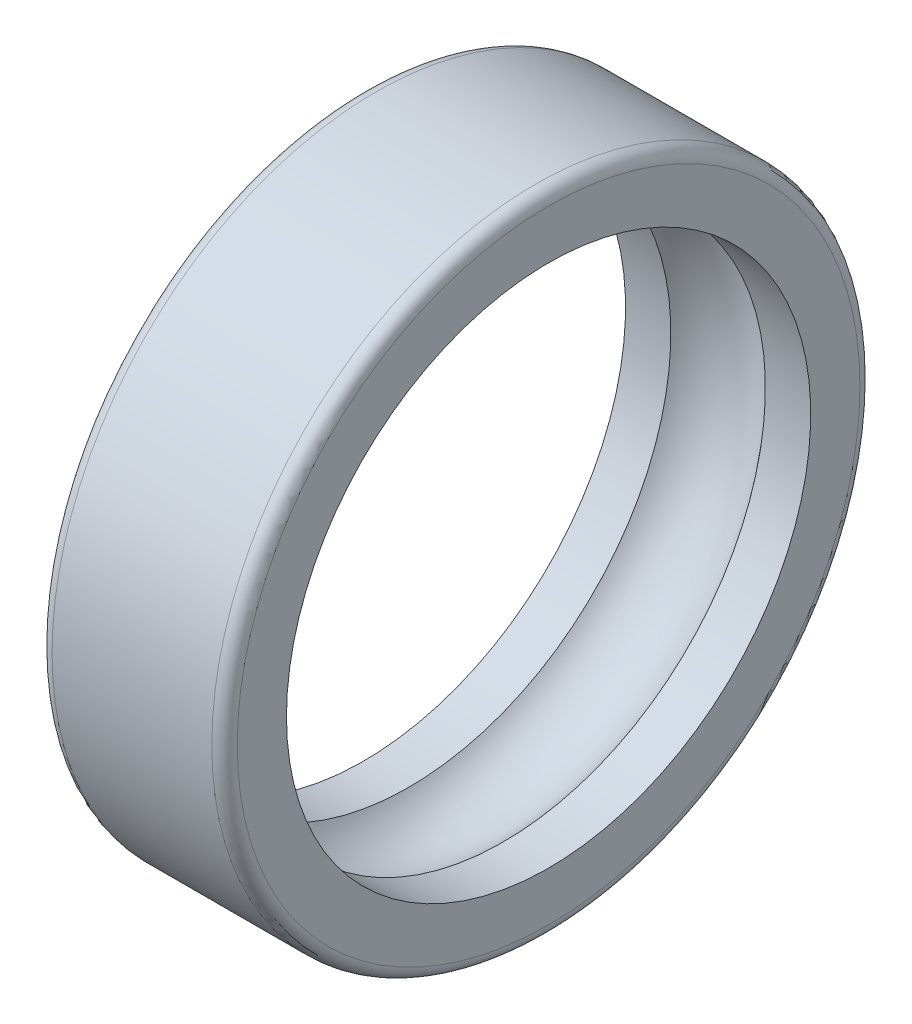
ISO-10303-21;
HEADER;
FILE_DESCRIPTION(('STEP AP214'),'2;1');
FILE_NAME('part.step','',(''),(''),'','','');
FILE_SCHEMA(('AUTOMOTIVE_DESIGN { 1 0 10303 214 1 1 1 1 }'));
ENDSEC;
DATA;
#1=APPLICATION_CONTEXT('core data for automotive mechanical design processes');
#2=APPLICATION_PROTOCOL_DEFINITION('international standard','automotive_design',2000,#1);
#3=PRODUCT_CONTEXT('',#1,'mechanical');
#4=PRODUCT('Part','Part','',(#3));
#5=PRODUCT_RELATED_PRODUCT_CATEGORY('part','',(#4));
#6=PRODUCT_DEFINITION_FORMATION('','',#4);
#7=PRODUCT_DEFINITION_CONTEXT('part definition',#1,'design');
#8=PRODUCT_DEFINITION('design','',#6,#7);
#9=PRODUCT_DEFINITION_SHAPE('','',#8);
#10=(LENGTH_UNIT() NAMED_UNIT(*) SI_UNIT(.MILLI.,.METRE.));
#11=(NAMED_UNIT(*) PLANE_ANGLE_UNIT() SI_UNIT($,.RADIAN.));
#12=(NAMED_UNIT(*) SI_UNIT($,.STERADIAN.) SOLID_ANGLE_UNIT());
#13=UNCERTAINTY_MEASURE_WITH_UNIT(LENGTH_MEASURE(1.E-05),#10,'distance_accuracy_value','');
#14=(GEOMETRIC_REPRESENTATION_CONTEXT(3) GLOBAL_UNCERTAINTY_ASSIGNED_CONTEXT((#13)) GLOBAL_UNIT_ASSIGNED_CONTEXT((#10,
#11,#12)) REPRESENTATION_CONTEXT('',''));
#15=CARTESIAN_POINT('',(0.,0.,0.));
#16=DIRECTION('',(0.,0.,1.));
#17=DIRECTION('',(1.,0.,0.));
#18=AXIS2_PLACEMENT_3D('',#15,#16,#17);
#19=CARTESIAN_POINT('',(1.10000000000035,0.,0.));
#20=DIRECTION('',(-1.,0.,0.));
#21=DIRECTION('',(0.,0.,1.));
#22=AXIS2_PLACEMENT_3D('',#19,#20,#21);
#23=TOROIDAL_SURFACE('',#22,26.8999999999997,1.10000000000035);
#24=CARTESIAN_POINT('',(0.,0.,0.));
#25=DIRECTION('',(-1.,0.,0.));
#26=DIRECTION('',(0.,0.,1.));
#27=AXIS2_PLACEMENT_3D('',#24,#25,#26);
#28=CIRCLE('',#27,26.9);
#29=CARTESIAN_POINT('',(0.,0.,26.9));
#30=VERTEX_POINT('',#29);
#31=EDGE_CURVE('E10',#30,#30,#28,.T.);
#32=ORIENTED_EDGE('',*,*,#31,.F.);
#33=EDGE_LOOP('',(#32));
#34=FACE_BOUND('',#33,.T.);
#35=CARTESIAN_POINT('',(1.09999999999999,0.,0.));
#36=DIRECTION('',(-1.,0.,0.));
#37=DIRECTION('',(0.,0.,1.));
#38=AXIS2_PLACEMENT_3D('',#35,#36,#37);
#39=CIRCLE('',#38,28.);
#40=CARTESIAN_POINT('',(1.09999999999999,0.,28.));
#41=VERTEX_POINT('',#40);
#42=EDGE_CURVE('E63',#41,#41,#39,.T.);
#43=ORIENTED_EDGE('',*,*,#42,.T.);
#44=EDGE_LOOP('',(#43));
#45=FACE_BOUND('',#44,.T.);
#46=ADVANCED_FACE('F35',(#34,#45),#23,.T.);
#47=CARTESIAN_POINT('',(0.,26.9,0.));
#48=DIRECTION('',(1.,0.,0.));
#49=DIRECTION('',(0.,0.,-1.));
#50=AXIS2_PLACEMENT_3D('',#47,#48,#49);
#51=PLANE('',#50);
#52=CARTESIAN_POINT('',(0.,0.,0.));
#53=DIRECTION('',(-1.,0.,0.));
#54=DIRECTION('',(0.,0.,1.));
#55=AXIS2_PLACEMENT_3D('',#52,#53,#54);
#56=CIRCLE('',#55,22.65);
#57=CARTESIAN_POINT('',(0.,0.,22.65));
#58=VERTEX_POINT('',#57);
#59=EDGE_CURVE('E41',#58,#58,#56,.T.);
#60=ORIENTED_EDGE('',*,*,#59,.F.);
#61=EDGE_LOOP('',(#60));
#62=FACE_BOUND('',#61,.T.);
#63=ORIENTED_EDGE('',*,*,#31,.T.);
#64=EDGE_LOOP('',(#63));
#65=FACE_BOUND('',#64,.T.);
#66=ADVANCED_FACE('F100',(#62,#65),#51,.F.);
#67=CARTESIAN_POINT('',(200.,0.,0.));
#68=DIRECTION('',(-1.,0.,0.));
#69=DIRECTION('',(0.,0.,1.));
#70=AXIS2_PLACEMENT_3D('',#67,#68,#69);
#71=CYLINDRICAL_SURFACE('',#70,22.65);
#72=CARTESIAN_POINT('',(3.91368867436659,0.,0.));
#73=DIRECTION('',(-1.,0.,0.));
#74=DIRECTION('',(0.,0.,1.));
#75=AXIS2_PLACEMENT_3D('',#72,#73,#74);
#76=CIRCLE('',#75,22.65);
#77=CARTESIAN_POINT('',(3.91368867436659,0.,22.65));
#78=VERTEX_POINT('',#77);
#79=EDGE_CURVE('E45',#78,#78,#76,.T.);
#80=ORIENTED_EDGE('',*,*,#79,.F.);
#81=EDGE_LOOP('',(#80));
#82=FACE_BOUND('',#81,.T.);
#83=ORIENTED_EDGE('',*,*,#59,.T.);
#84=EDGE_LOOP('',(#83));
#85=FACE_BOUND('',#84,.T.);
#86=ADVANCED_FACE('F95',(#82,#85),#71,.F.);
#87=CARTESIAN_POINT('',(7.9999999999998,0.,0.));
#88=DIRECTION('',(-1.,0.,0.));
#89=DIRECTION('',(0.,0.,1.));
#90=AXIS2_PLACEMENT_3D('',#87,#88,#89);
#91=TOROIDAL_SURFACE('',#90,19.5000000000005,5.15949999999954);
#92=CARTESIAN_POINT('',(12.086311325633,0.,0.));
#93=DIRECTION('',(-1.,0.,0.));
#94=DIRECTION('',(0.,0.,1.));
#95=AXIS2_PLACEMENT_3D('',#92,#93,#94);
#96=CIRCLE('',#95,22.65);
#97=CARTESIAN_POINT('',(12.086311325633,0.,22.65));
#98=VERTEX_POINT('',#97);
#99=EDGE_CURVE('E49',#98,#98,#96,.T.);
#100=ORIENTED_EDGE('',*,*,#99,.F.);
#101=EDGE_LOOP('',(#100));
#102=FACE_BOUND('',#101,.T.);
#103=ORIENTED_EDGE('',*,*,#79,.T.);
#104=EDGE_LOOP('',(#103));
#105=FACE_BOUND('',#104,.T.);
#106=ADVANCED_FACE('F89',(#102,#105),#91,.F.);
#107=CARTESIAN_POINT('',(200.,0.,0.));
#108=DIRECTION('',(-1.,0.,0.));
#109=DIRECTION('',(0.,0.,1.));
#110=AXIS2_PLACEMENT_3D('',#107,#108,#109);
#111=CYLINDRICAL_SURFACE('',#110,22.65);
#112=CARTESIAN_POINT('',(16.,0.,0.));
#113=DIRECTION('',(-1.,0.,0.));
#114=DIRECTION('',(0.,0.,1.));
#115=AXIS2_PLACEMENT_3D('',#112,#113,#114);
#116=CIRCLE('',#115,22.65);
#117=CARTESIAN_POINT('',(16.,0.,22.65));
#118=VERTEX_POINT('',#117);
#119=EDGE_CURVE('E54',#118,#118,#116,.T.);
#120=ORIENTED_EDGE('',*,*,#119,.F.);
#121=EDGE_LOOP('',(#120));
#122=FACE_BOUND('',#121,.T.);
#123=ORIENTED_EDGE('',*,*,#99,.T.);
#124=EDGE_LOOP('',(#123));
#125=FACE_BOUND('',#124,.T.);
#126=ADVANCED_FACE('F83',(#122,#125),#111,.F.);
#127=CARTESIAN_POINT('',(16.,22.65,0.));
#128=DIRECTION('',(-1.,0.,0.));
#129=DIRECTION('',(0.,0.,1.));
#130=AXIS2_PLACEMENT_3D('',#127,#128,#129);
#131=PLANE('',#130);
#132=CARTESIAN_POINT('',(16.,0.,0.));
#133=DIRECTION('',(-1.,0.,0.));
#134=DIRECTION('',(0.,0.,1.));
#135=AXIS2_PLACEMENT_3D('',#132,#133,#134);
#136=CIRCLE('',#135,26.9);
#137=CARTESIAN_POINT('',(16.,0.,26.9));
#138=VERTEX_POINT('',#137);
#139=EDGE_CURVE('E57',#138,#138,#136,.T.);
#140=ORIENTED_EDGE('',*,*,#139,.F.);
#141=EDGE_LOOP('',(#140));
#142=FACE_BOUND('',#141,.T.);
#143=ORIENTED_EDGE('',*,*,#119,.T.);
#144=EDGE_LOOP('',(#143));
#145=FACE_BOUND('',#144,.T.);
#146=ADVANCED_FACE('F77',(#142,#145),#131,.F.);
#147=CARTESIAN_POINT('',(14.8999999999993,0.,0.));
#148=DIRECTION('',(-1.,0.,0.));
#149=DIRECTION('',(0.,0.,1.));
#150=AXIS2_PLACEMENT_3D('',#147,#148,#149);
#151=TOROIDAL_SURFACE('',#150,26.8999999999993,1.10000000000069);
#152=CARTESIAN_POINT('',(14.9,0.,0.));
#153=DIRECTION('',(-1.,0.,0.));
#154=DIRECTION('',(0.,0.,1.));
#155=AXIS2_PLACEMENT_3D('',#152,#153,#154);
#156=CIRCLE('',#155,28.);
#157=CARTESIAN_POINT('',(14.9,0.,28.));
#158=VERTEX_POINT('',#157);
#159=EDGE_CURVE('E60',#158,#158,#156,.T.);
#160=ORIENTED_EDGE('',*,*,#159,.F.);
#161=EDGE_LOOP('',(#160));
#162=FACE_BOUND('',#161,.T.);
#163=ORIENTED_EDGE('',*,*,#139,.T.);
#164=EDGE_LOOP('',(#163));
#165=FACE_BOUND('',#164,.T.);
#166=ADVANCED_FACE('F71',(#162,#165),#151,.T.);
#167=CARTESIAN_POINT('',(200.,0.,0.));
#168=DIRECTION('',(-1.,0.,0.));
#169=DIRECTION('',(0.,0.,1.));
#170=AXIS2_PLACEMENT_3D('',#167,#168,#169);
#171=CYLINDRICAL_SURFACE('',#170,28.);
#172=ORIENTED_EDGE('',*,*,#42,.F.);
#173=EDGE_LOOP('',(#172));
#174=FACE_BOUND('',#173,.T.);
#175=ORIENTED_EDGE('',*,*,#159,.T.);
#176=EDGE_LOOP('',(#175));
#177=FACE_BOUND('',#176,.T.);
#178=ADVANCED_FACE('F68',(#174,#177),#171,.T.);
#179=CLOSED_SHELL('',(#46,#66,#86,#106,#126,#146,#166,#178));
#180=MANIFOLD_SOLID_BREP('B2',#179);
#181=ADVANCED_BREP_SHAPE_REPRESENTATION('',(#18,#180),#14);
#182=SHAPE_DEFINITION_REPRESENTATION(#9,#181);
ENDSEC;
END-ISO-10303-21;
